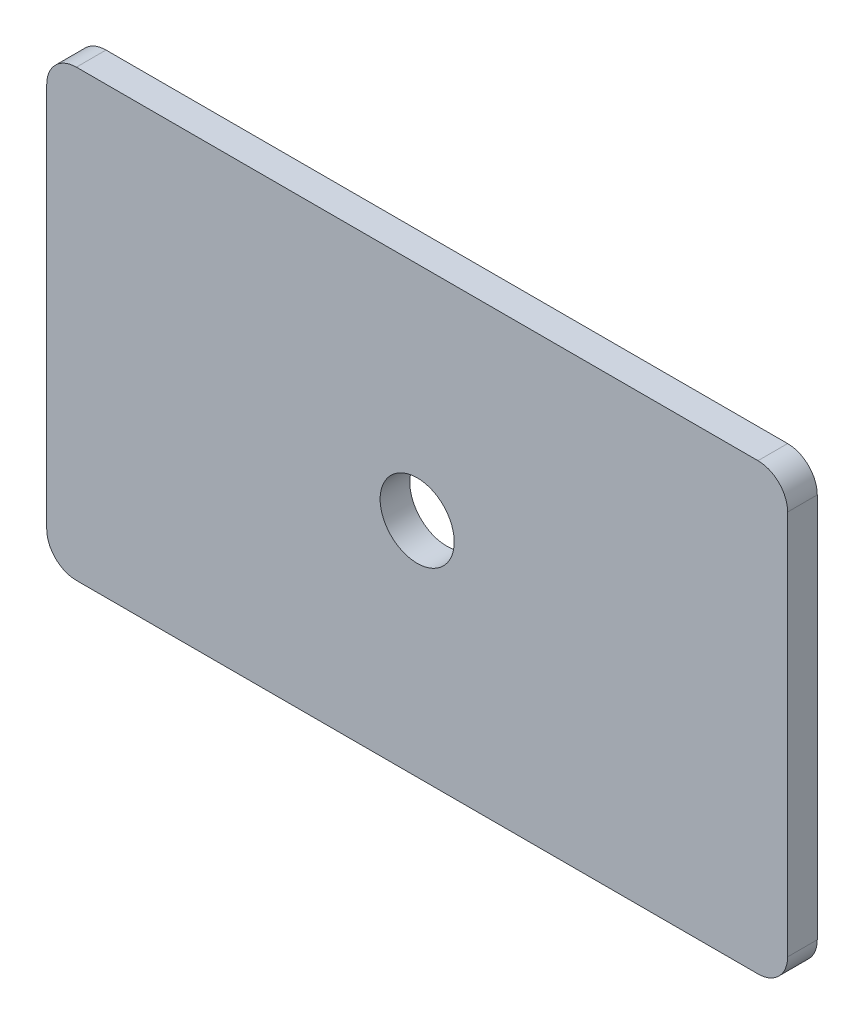
ISO-10303-21;
HEADER;
FILE_DESCRIPTION(('STEP AP214'),'2;1');
FILE_NAME('part.step','',(''),(''),'','','');
FILE_SCHEMA(('AUTOMOTIVE_DESIGN { 1 0 10303 214 1 1 1 1 }'));
ENDSEC;
DATA;
#1=APPLICATION_CONTEXT('core data for automotive mechanical design processes');
#2=APPLICATION_PROTOCOL_DEFINITION('international standard','automotive_design',2000,#1);
#3=PRODUCT_CONTEXT('',#1,'mechanical');
#4=PRODUCT('Part','Part','',(#3));
#5=PRODUCT_RELATED_PRODUCT_CATEGORY('part','',(#4));
#6=PRODUCT_DEFINITION_FORMATION('','',#4);
#7=PRODUCT_DEFINITION_CONTEXT('part definition',#1,'design');
#8=PRODUCT_DEFINITION('design','',#6,#7);
#9=PRODUCT_DEFINITION_SHAPE('','',#8);
#10=(LENGTH_UNIT() NAMED_UNIT(*) SI_UNIT(.MILLI.,.METRE.));
#11=(NAMED_UNIT(*) PLANE_ANGLE_UNIT() SI_UNIT($,.RADIAN.));
#12=(NAMED_UNIT(*) SI_UNIT($,.STERADIAN.) SOLID_ANGLE_UNIT());
#13=UNCERTAINTY_MEASURE_WITH_UNIT(LENGTH_MEASURE(1.E-05),#10,'distance_accuracy_value','');
#14=(GEOMETRIC_REPRESENTATION_CONTEXT(3) GLOBAL_UNCERTAINTY_ASSIGNED_CONTEXT((#13)) GLOBAL_UNIT_ASSIGNED_CONTEXT((#10,
#11,#12)) REPRESENTATION_CONTEXT('',''));
#15=CARTESIAN_POINT('',(0.,0.,0.));
#16=DIRECTION('',(0.,0.,1.));
#17=DIRECTION('',(1.,0.,0.));
#18=AXIS2_PLACEMENT_3D('',#15,#16,#17);
#19=CARTESIAN_POINT('',(0.,0.,10.));
#20=DIRECTION('',(0.,0.,1.));
#21=DIRECTION('',(1.,0.,0.));
#22=AXIS2_PLACEMENT_3D('',#19,#20,#21);
#23=PLANE('',#22);
#24=DIRECTION('',(0.,-1.,0.));
#25=VECTOR('',#24,1.);
#26=CARTESIAN_POINT('',(-125.,75.,10.));
#27=LINE('',#26,#25);
#28=CARTESIAN_POINT('',(-125.,65.,10.));
#29=VERTEX_POINT('',#28);
#30=CARTESIAN_POINT('',(-125.,-65.,10.));
#31=VERTEX_POINT('',#30);
#32=EDGE_CURVE('E137',#29,#31,#27,.T.);
#33=ORIENTED_EDGE('',*,*,#32,.T.);
#34=CARTESIAN_POINT('',(-115.,-65.,10.));
#35=DIRECTION('',(0.,0.,1.));
#36=DIRECTION('',(1.,0.,0.));
#37=AXIS2_PLACEMENT_3D('',#34,#35,#36);
#38=CIRCLE('',#37,10.);
#39=CARTESIAN_POINT('',(-115.,-75.,10.));
#40=VERTEX_POINT('',#39);
#41=EDGE_CURVE('E152',#31,#40,#38,.T.);
#42=ORIENTED_EDGE('',*,*,#41,.T.);
#43=DIRECTION('',(1.,0.,0.));
#44=VECTOR('',#43,1.);
#45=CARTESIAN_POINT('',(-125.,-75.,10.));
#46=LINE('',#45,#44);
#47=CARTESIAN_POINT('',(115.,-75.,10.));
#48=VERTEX_POINT('',#47);
#49=EDGE_CURVE('E119',#40,#48,#46,.T.);
#50=ORIENTED_EDGE('',*,*,#49,.T.);
#51=CARTESIAN_POINT('',(115.,-65.,10.));
#52=DIRECTION('',(0.,0.,1.));
#53=DIRECTION('',(1.,0.,0.));
#54=AXIS2_PLACEMENT_3D('',#51,#52,#53);
#55=CIRCLE('',#54,10.);
#56=CARTESIAN_POINT('',(125.,-65.,10.));
#57=VERTEX_POINT('',#56);
#58=EDGE_CURVE('E150',#48,#57,#55,.T.);
#59=ORIENTED_EDGE('',*,*,#58,.T.);
#60=DIRECTION('',(0.,1.,0.));
#61=VECTOR('',#60,1.);
#62=CARTESIAN_POINT('',(125.,75.,10.));
#63=LINE('',#62,#61);
#64=CARTESIAN_POINT('',(125.,65.,10.));
#65=VERTEX_POINT('',#64);
#66=EDGE_CURVE('E163',#57,#65,#63,.T.);
#67=ORIENTED_EDGE('',*,*,#66,.T.);
#68=CARTESIAN_POINT('',(115.,65.,10.));
#69=DIRECTION('',(0.,0.,1.));
#70=DIRECTION('',(1.,0.,0.));
#71=AXIS2_PLACEMENT_3D('',#68,#69,#70);
#72=CIRCLE('',#71,10.);
#73=CARTESIAN_POINT('',(115.,75.,10.));
#74=VERTEX_POINT('',#73);
#75=EDGE_CURVE('E54',#65,#74,#72,.T.);
#76=ORIENTED_EDGE('',*,*,#75,.T.);
#77=DIRECTION('',(-1.,0.,0.));
#78=VECTOR('',#77,1.);
#79=CARTESIAN_POINT('',(-125.,75.,10.));
#80=LINE('',#79,#78);
#81=CARTESIAN_POINT('',(-115.,75.,10.));
#82=VERTEX_POINT('',#81);
#83=EDGE_CURVE('E138',#74,#82,#80,.T.);
#84=ORIENTED_EDGE('',*,*,#83,.T.);
#85=CARTESIAN_POINT('',(-115.,65.,10.));
#86=DIRECTION('',(0.,0.,1.));
#87=DIRECTION('',(1.,0.,0.));
#88=AXIS2_PLACEMENT_3D('',#85,#86,#87);
#89=CIRCLE('',#88,10.);
#90=EDGE_CURVE('E147',#82,#29,#89,.T.);
#91=ORIENTED_EDGE('',*,*,#90,.T.);
#92=EDGE_LOOP('',(#33,#42,#50,#59,#67,#76,#84,#91));
#93=FACE_BOUND('',#92,.T.);
#94=CARTESIAN_POINT('',(0.,0.,10.));
#95=DIRECTION('',(0.,0.,1.));
#96=DIRECTION('',(1.,0.,0.));
#97=AXIS2_PLACEMENT_3D('',#94,#95,#96);
#98=CIRCLE('',#97,12.5);
#99=CARTESIAN_POINT('',(12.5,0.,10.));
#100=VERTEX_POINT('',#99);
#101=EDGE_CURVE('E132',#100,#100,#98,.T.);
#102=ORIENTED_EDGE('',*,*,#101,.F.);
#103=EDGE_LOOP('',(#102));
#104=FACE_BOUND('',#103,.T.);
#105=ADVANCED_FACE('F33',(#93,#104),#23,.T.);
#106=CARTESIAN_POINT('',(0.,0.,0.));
#107=DIRECTION('',(0.,0.,1.));
#108=DIRECTION('',(1.,0.,0.));
#109=AXIS2_PLACEMENT_3D('',#106,#107,#108);
#110=PLANE('',#109);
#111=DIRECTION('',(1.,0.,0.));
#112=VECTOR('',#111,1.);
#113=CARTESIAN_POINT('',(-125.,-75.,0.));
#114=LINE('',#113,#112);
#115=CARTESIAN_POINT('',(-115.,-75.,0.));
#116=VERTEX_POINT('',#115);
#117=CARTESIAN_POINT('',(115.,-75.,0.));
#118=VERTEX_POINT('',#117);
#119=EDGE_CURVE('E116',#116,#118,#114,.T.);
#120=ORIENTED_EDGE('',*,*,#119,.F.);
#121=CARTESIAN_POINT('',(-115.,-65.,0.));
#122=DIRECTION('',(0.,0.,1.));
#123=DIRECTION('',(1.,0.,0.));
#124=AXIS2_PLACEMENT_3D('',#121,#122,#123);
#125=CIRCLE('',#124,10.);
#126=CARTESIAN_POINT('',(-125.,-65.,0.));
#127=VERTEX_POINT('',#126);
#128=EDGE_CURVE('E99',#116,#127,#125,.F.);
#129=ORIENTED_EDGE('',*,*,#128,.T.);
#130=DIRECTION('',(0.,-1.,0.));
#131=VECTOR('',#130,1.);
#132=CARTESIAN_POINT('',(-125.,75.,0.));
#133=LINE('',#132,#131);
#134=CARTESIAN_POINT('',(-125.,65.,0.));
#135=VERTEX_POINT('',#134);
#136=EDGE_CURVE('E127',#135,#127,#133,.T.);
#137=ORIENTED_EDGE('',*,*,#136,.F.);
#138=CARTESIAN_POINT('',(-115.,65.,0.));
#139=DIRECTION('',(0.,0.,1.));
#140=DIRECTION('',(1.,0.,0.));
#141=AXIS2_PLACEMENT_3D('',#138,#139,#140);
#142=CIRCLE('',#141,10.);
#143=CARTESIAN_POINT('',(-115.,75.,0.));
#144=VERTEX_POINT('',#143);
#145=EDGE_CURVE('E120',#135,#144,#142,.F.);
#146=ORIENTED_EDGE('',*,*,#145,.T.);
#147=DIRECTION('',(-1.,0.,0.));
#148=VECTOR('',#147,1.);
#149=CARTESIAN_POINT('',(-125.,75.,0.));
#150=LINE('',#149,#148);
#151=CARTESIAN_POINT('',(115.,75.,0.));
#152=VERTEX_POINT('',#151);
#153=EDGE_CURVE('E130',#152,#144,#150,.T.);
#154=ORIENTED_EDGE('',*,*,#153,.F.);
#155=CARTESIAN_POINT('',(115.,65.,0.));
#156=DIRECTION('',(0.,0.,1.));
#157=DIRECTION('',(1.,0.,0.));
#158=AXIS2_PLACEMENT_3D('',#155,#156,#157);
#159=CIRCLE('',#158,10.);
#160=CARTESIAN_POINT('',(125.,65.,0.));
#161=VERTEX_POINT('',#160);
#162=EDGE_CURVE('E141',#152,#161,#159,.F.);
#163=ORIENTED_EDGE('',*,*,#162,.T.);
#164=DIRECTION('',(0.,1.,0.));
#165=VECTOR('',#164,1.);
#166=CARTESIAN_POINT('',(125.,75.,0.));
#167=LINE('',#166,#165);
#168=CARTESIAN_POINT('',(125.,-65.,0.));
#169=VERTEX_POINT('',#168);
#170=EDGE_CURVE('E126',#169,#161,#167,.T.);
#171=ORIENTED_EDGE('',*,*,#170,.F.);
#172=CARTESIAN_POINT('',(115.,-65.,0.));
#173=DIRECTION('',(0.,0.,1.));
#174=DIRECTION('',(1.,0.,0.));
#175=AXIS2_PLACEMENT_3D('',#172,#173,#174);
#176=CIRCLE('',#175,10.);
#177=EDGE_CURVE('E110',#169,#118,#176,.F.);
#178=ORIENTED_EDGE('',*,*,#177,.T.);
#179=EDGE_LOOP('',(#120,#129,#137,#146,#154,#163,#171,#178));
#180=FACE_BOUND('',#179,.T.);
#181=CARTESIAN_POINT('',(0.,0.,0.));
#182=DIRECTION('',(0.,0.,1.));
#183=DIRECTION('',(1.,0.,0.));
#184=AXIS2_PLACEMENT_3D('',#181,#182,#183);
#185=CIRCLE('',#184,12.5);
#186=CARTESIAN_POINT('',(12.5,0.,0.));
#187=VERTEX_POINT('',#186);
#188=EDGE_CURVE('E177',#187,#187,#185,.T.);
#189=ORIENTED_EDGE('',*,*,#188,.T.);
#190=EDGE_LOOP('',(#189));
#191=FACE_BOUND('',#190,.T.);
#192=ADVANCED_FACE('F123',(#180,#191),#110,.F.);
#193=CARTESIAN_POINT('',(-125.,75.,10.));
#194=DIRECTION('',(1.,0.,0.));
#195=DIRECTION('',(0.,0.,-1.));
#196=AXIS2_PLACEMENT_3D('',#193,#194,#195);
#197=PLANE('',#196);
#198=ORIENTED_EDGE('',*,*,#136,.T.);
#199=DIRECTION('',(0.,0.,-1.));
#200=VECTOR('',#199,1.);
#201=CARTESIAN_POINT('',(-125.,-65.,10.));
#202=LINE('',#201,#200);
#203=EDGE_CURVE('E104',#127,#31,#202,.F.);
#204=ORIENTED_EDGE('',*,*,#203,.T.);
#205=ORIENTED_EDGE('',*,*,#32,.F.);
#206=DIRECTION('',(0.,0.,-1.));
#207=VECTOR('',#206,1.);
#208=CARTESIAN_POINT('',(-125.,65.,10.));
#209=LINE('',#208,#207);
#210=EDGE_CURVE('E109',#29,#135,#209,.T.);
#211=ORIENTED_EDGE('',*,*,#210,.T.);
#212=EDGE_LOOP('',(#198,#204,#205,#211));
#213=FACE_BOUND('',#212,.T.);
#214=ADVANCED_FACE('F191',(#213),#197,.F.);
#215=CARTESIAN_POINT('',(-125.,-75.,10.));
#216=DIRECTION('',(0.,1.,0.));
#217=DIRECTION('',(0.,0.,1.));
#218=AXIS2_PLACEMENT_3D('',#215,#216,#217);
#219=PLANE('',#218);
#220=ORIENTED_EDGE('',*,*,#49,.F.);
#221=DIRECTION('',(0.,0.,-1.));
#222=VECTOR('',#221,1.);
#223=CARTESIAN_POINT('',(-115.,-75.,10.));
#224=LINE('',#223,#222);
#225=EDGE_CURVE('E103',#40,#116,#224,.T.);
#226=ORIENTED_EDGE('',*,*,#225,.T.);
#227=ORIENTED_EDGE('',*,*,#119,.T.);
#228=DIRECTION('',(0.,0.,-1.));
#229=VECTOR('',#228,1.);
#230=CARTESIAN_POINT('',(115.,-75.,10.));
#231=LINE('',#230,#229);
#232=EDGE_CURVE('E121',#118,#48,#231,.F.);
#233=ORIENTED_EDGE('',*,*,#232,.T.);
#234=EDGE_LOOP('',(#220,#226,#227,#233));
#235=FACE_BOUND('',#234,.T.);
#236=ADVANCED_FACE('F115',(#235),#219,.F.);
#237=CARTESIAN_POINT('',(125.,75.,10.));
#238=DIRECTION('',(-1.,0.,0.));
#239=DIRECTION('',(0.,0.,1.));
#240=AXIS2_PLACEMENT_3D('',#237,#238,#239);
#241=PLANE('',#240);
#242=ORIENTED_EDGE('',*,*,#66,.F.);
#243=DIRECTION('',(0.,0.,-1.));
#244=VECTOR('',#243,1.);
#245=CARTESIAN_POINT('',(125.,-65.,10.));
#246=LINE('',#245,#244);
#247=EDGE_CURVE('E156',#57,#169,#246,.T.);
#248=ORIENTED_EDGE('',*,*,#247,.T.);
#249=ORIENTED_EDGE('',*,*,#170,.T.);
#250=DIRECTION('',(0.,0.,-1.));
#251=VECTOR('',#250,1.);
#252=CARTESIAN_POINT('',(125.,65.,10.));
#253=LINE('',#252,#251);
#254=EDGE_CURVE('E154',#161,#65,#253,.F.);
#255=ORIENTED_EDGE('',*,*,#254,.T.);
#256=EDGE_LOOP('',(#242,#248,#249,#255));
#257=FACE_BOUND('',#256,.T.);
#258=ADVANCED_FACE('F161',(#257),#241,.F.);
#259=CARTESIAN_POINT('',(-125.,75.,10.));
#260=DIRECTION('',(0.,-1.,0.));
#261=DIRECTION('',(0.,0.,-1.));
#262=AXIS2_PLACEMENT_3D('',#259,#260,#261);
#263=PLANE('',#262);
#264=ORIENTED_EDGE('',*,*,#83,.F.);
#265=DIRECTION('',(0.,0.,-1.));
#266=VECTOR('',#265,1.);
#267=CARTESIAN_POINT('',(115.,75.,10.));
#268=LINE('',#267,#266);
#269=EDGE_CURVE('E11',#74,#152,#268,.T.);
#270=ORIENTED_EDGE('',*,*,#269,.T.);
#271=ORIENTED_EDGE('',*,*,#153,.T.);
#272=DIRECTION('',(0.,0.,-1.));
#273=VECTOR('',#272,1.);
#274=CARTESIAN_POINT('',(-115.,75.,10.));
#275=LINE('',#274,#273);
#276=EDGE_CURVE('E41',#144,#82,#275,.F.);
#277=ORIENTED_EDGE('',*,*,#276,.T.);
#278=EDGE_LOOP('',(#264,#270,#271,#277));
#279=FACE_BOUND('',#278,.T.);
#280=ADVANCED_FACE('F170',(#279),#263,.F.);
#281=CARTESIAN_POINT('',(0.,0.,10.));
#282=DIRECTION('',(0.,0.,-1.));
#283=DIRECTION('',(-1.,0.,0.));
#284=AXIS2_PLACEMENT_3D('',#281,#282,#283);
#285=CYLINDRICAL_SURFACE('',#284,12.5);
#286=ORIENTED_EDGE('',*,*,#101,.T.);
#287=EDGE_LOOP('',(#286));
#288=FACE_BOUND('',#287,.T.);
#289=ORIENTED_EDGE('',*,*,#188,.F.);
#290=EDGE_LOOP('',(#289));
#291=FACE_BOUND('',#290,.T.);
#292=ADVANCED_FACE('F183',(#288,#291),#285,.F.);
#293=CARTESIAN_POINT('',(-115.,-65.,10.));
#294=DIRECTION('',(0.,0.,-1.));
#295=DIRECTION('',(-1.,0.,0.));
#296=AXIS2_PLACEMENT_3D('',#293,#294,#295);
#297=CYLINDRICAL_SURFACE('',#296,10.);
#298=ORIENTED_EDGE('',*,*,#41,.F.);
#299=ORIENTED_EDGE('',*,*,#203,.F.);
#300=ORIENTED_EDGE('',*,*,#128,.F.);
#301=ORIENTED_EDGE('',*,*,#225,.F.);
#302=EDGE_LOOP('',(#298,#299,#300,#301));
#303=FACE_BOUND('',#302,.T.);
#304=ADVANCED_FACE('F102',(#303),#297,.T.);
#305=CARTESIAN_POINT('',(115.,-65.,10.));
#306=DIRECTION('',(0.,0.,-1.));
#307=DIRECTION('',(-1.,0.,0.));
#308=AXIS2_PLACEMENT_3D('',#305,#306,#307);
#309=CYLINDRICAL_SURFACE('',#308,10.);
#310=ORIENTED_EDGE('',*,*,#58,.F.);
#311=ORIENTED_EDGE('',*,*,#232,.F.);
#312=ORIENTED_EDGE('',*,*,#177,.F.);
#313=ORIENTED_EDGE('',*,*,#247,.F.);
#314=EDGE_LOOP('',(#310,#311,#312,#313));
#315=FACE_BOUND('',#314,.T.);
#316=ADVANCED_FACE('F206',(#315),#309,.T.);
#317=CARTESIAN_POINT('',(115.,65.,10.));
#318=DIRECTION('',(0.,0.,-1.));
#319=DIRECTION('',(-1.,0.,0.));
#320=AXIS2_PLACEMENT_3D('',#317,#318,#319);
#321=CYLINDRICAL_SURFACE('',#320,10.);
#322=ORIENTED_EDGE('',*,*,#75,.F.);
#323=ORIENTED_EDGE('',*,*,#254,.F.);
#324=ORIENTED_EDGE('',*,*,#162,.F.);
#325=ORIENTED_EDGE('',*,*,#269,.F.);
#326=EDGE_LOOP('',(#322,#323,#324,#325));
#327=FACE_BOUND('',#326,.T.);
#328=ADVANCED_FACE('F169',(#327),#321,.T.);
#329=CARTESIAN_POINT('',(-115.,65.,10.));
#330=DIRECTION('',(0.,0.,-1.));
#331=DIRECTION('',(-1.,0.,0.));
#332=AXIS2_PLACEMENT_3D('',#329,#330,#331);
#333=CYLINDRICAL_SURFACE('',#332,10.);
#334=ORIENTED_EDGE('',*,*,#90,.F.);
#335=ORIENTED_EDGE('',*,*,#276,.F.);
#336=ORIENTED_EDGE('',*,*,#145,.F.);
#337=ORIENTED_EDGE('',*,*,#210,.F.);
#338=EDGE_LOOP('',(#334,#335,#336,#337));
#339=FACE_BOUND('',#338,.T.);
#340=ADVANCED_FACE('F35',(#339),#333,.T.);
#341=CLOSED_SHELL('',(#105,#192,#214,#236,#258,#280,#292,#304,#316,#328,#340));
#342=MANIFOLD_SOLID_BREP('B2',#341);
#343=ADVANCED_BREP_SHAPE_REPRESENTATION('',(#18,#342),#14);
#344=SHAPE_DEFINITION_REPRESENTATION(#9,#343);
ENDSEC;
END-ISO-10303-21;
